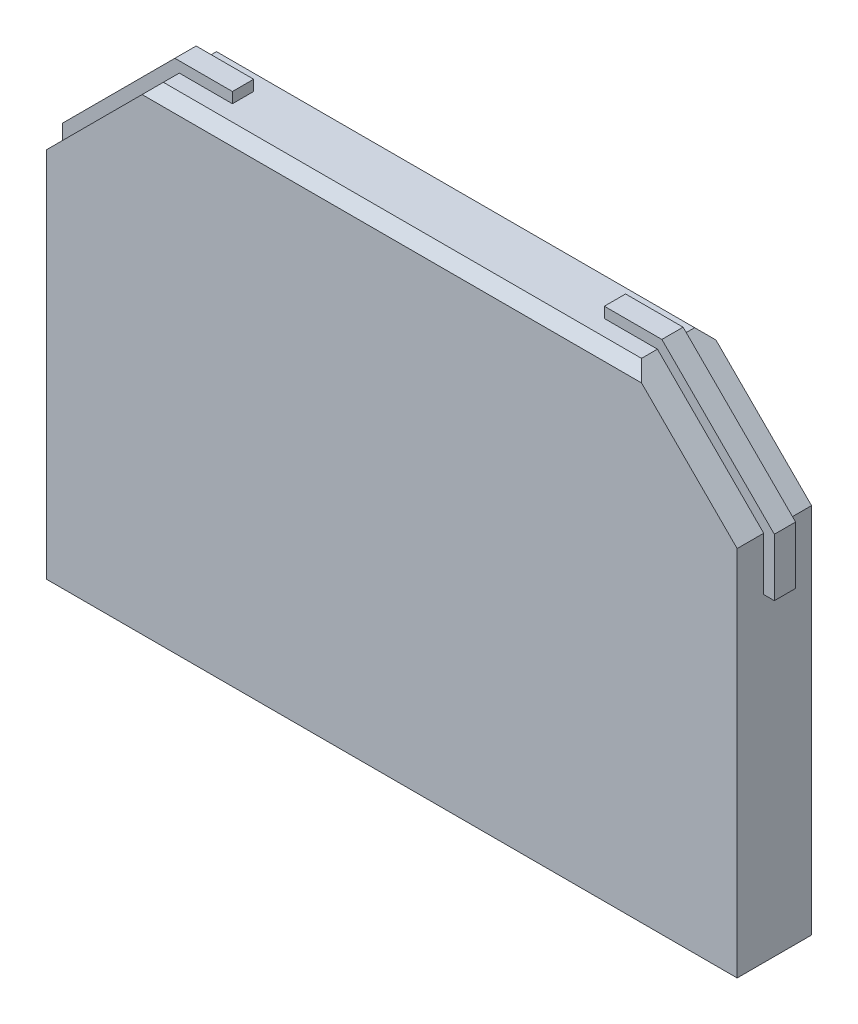
ISO-10303-21;
HEADER;
FILE_DESCRIPTION(('STEP AP214'),'2;1');
FILE_NAME('part.step','',(''),(''),'','','');
FILE_SCHEMA(('AUTOMOTIVE_DESIGN { 1 0 10303 214 1 1 1 1 }'));
ENDSEC;
DATA;
#1=APPLICATION_CONTEXT('core data for automotive mechanical design processes');
#2=APPLICATION_PROTOCOL_DEFINITION('international standard','automotive_design',2000,#1);
#3=PRODUCT_CONTEXT('',#1,'mechanical');
#4=PRODUCT('Part','Part','',(#3));
#5=PRODUCT_RELATED_PRODUCT_CATEGORY('part','',(#4));
#6=PRODUCT_DEFINITION_FORMATION('','',#4);
#7=PRODUCT_DEFINITION_CONTEXT('part definition',#1,'design');
#8=PRODUCT_DEFINITION('design','',#6,#7);
#9=PRODUCT_DEFINITION_SHAPE('','',#8);
#10=(LENGTH_UNIT() NAMED_UNIT(*) SI_UNIT(.MILLI.,.METRE.));
#11=(NAMED_UNIT(*) PLANE_ANGLE_UNIT() SI_UNIT($,.RADIAN.));
#12=(NAMED_UNIT(*) SI_UNIT($,.STERADIAN.) SOLID_ANGLE_UNIT());
#13=UNCERTAINTY_MEASURE_WITH_UNIT(LENGTH_MEASURE(1.E-05),#10,'distance_accuracy_value','');
#14=(GEOMETRIC_REPRESENTATION_CONTEXT(3) GLOBAL_UNCERTAINTY_ASSIGNED_CONTEXT((#13)) GLOBAL_UNIT_ASSIGNED_CONTEXT((#10,
#11,#12)) REPRESENTATION_CONTEXT('',''));
#15=CARTESIAN_POINT('',(0.,0.,0.));
#16=DIRECTION('',(0.,0.,1.));
#17=DIRECTION('',(1.,0.,0.));
#18=AXIS2_PLACEMENT_3D('',#15,#16,#17);
#19=CARTESIAN_POINT('',(0.,6.5,-0.25));
#20=DIRECTION('',(0.,-0.707106781186498,0.707106781186598));
#21=DIRECTION('',(-1.,0.,0.));
#22=AXIS2_PLACEMENT_3D('',#19,#20,#21);
#23=PLANE('',#22);
#24=DIRECTION('',(0.577350269189626,-0.577350269189626,-0.577350269189626));
#25=VECTOR('',#24,1.);
#26=CARTESIAN_POINT('',(2.25,6.5,-0.25));
#27=LINE('',#26,#25);
#28=CARTESIAN_POINT('',(2.25,6.5,-0.25));
#29=VERTEX_POINT('',#28);
#30=CARTESIAN_POINT('',(2.35,6.4,-0.35));
#31=VERTEX_POINT('',#30);
#32=EDGE_CURVE('E399',#29,#31,#27,.T.);
#33=ORIENTED_EDGE('',*,*,#32,.T.);
#34=DIRECTION('',(-1.,0.,0.));
#35=VECTOR('',#34,1.);
#36=CARTESIAN_POINT('',(2.35,6.4,-0.35));
#37=LINE('',#36,#35);
#38=CARTESIAN_POINT('',(-2.35,6.4,-0.35));
#39=VERTEX_POINT('',#38);
#40=EDGE_CURVE('E489',#31,#39,#37,.T.);
#41=ORIENTED_EDGE('',*,*,#40,.T.);
#42=DIRECTION('',(0.577350269189626,0.577350269189626,0.577350269189626));
#43=VECTOR('',#42,1.);
#44=CARTESIAN_POINT('',(-2.35,6.4,-0.35));
#45=LINE('',#44,#43);
#46=CARTESIAN_POINT('',(-2.25,6.5,-0.25));
#47=VERTEX_POINT('',#46);
#48=EDGE_CURVE('E37',#39,#47,#45,.T.);
#49=ORIENTED_EDGE('',*,*,#48,.T.);
#50=DIRECTION('',(1.,0.,0.));
#51=VECTOR('',#50,1.);
#52=CARTESIAN_POINT('',(-2.25,6.5,-0.25));
#53=LINE('',#52,#51);
#54=EDGE_CURVE('E355',#47,#29,#53,.T.);
#55=ORIENTED_EDGE('',*,*,#54,.T.);
#56=EDGE_LOOP('',(#33,#41,#49,#55));
#57=FACE_BOUND('',#56,.T.);
#58=ADVANCED_FACE('F17',(#57),#23,.F.);
#59=CARTESIAN_POINT('',(-2.291421356237,6.6,0.1));
#60=DIRECTION('',(-0.707106781186548,0.707106781186548,0.));
#61=DIRECTION('',(0.,0.,1.));
#62=AXIS2_PLACEMENT_3D('',#59,#60,#61);
#63=PLANE('',#62);
#64=DIRECTION('',(0.707106781186548,0.707106781186548,0.));
#65=VECTOR('',#64,1.);
#66=CARTESIAN_POINT('',(-3.35,5.541421356237,-0.1));
#67=LINE('',#66,#65);
#68=CARTESIAN_POINT('',(-3.35,5.541421356237,-0.1));
#69=VERTEX_POINT('',#68);
#70=CARTESIAN_POINT('',(-2.291421356237,6.6,-0.1));
#71=VERTEX_POINT('',#70);
#72=EDGE_CURVE('E432',#69,#71,#67,.T.);
#73=ORIENTED_EDGE('',*,*,#72,.F.);
#74=DIRECTION('',(0.,0.,1.));
#75=VECTOR('',#74,1.);
#76=CARTESIAN_POINT('',(-3.35,5.541421356237,-0.1));
#77=LINE('',#76,#75);
#78=CARTESIAN_POINT('',(-3.35,5.541421356237,0.1));
#79=VERTEX_POINT('',#78);
#80=EDGE_CURVE('E11',#69,#79,#77,.T.);
#81=ORIENTED_EDGE('',*,*,#80,.T.);
#82=DIRECTION('',(-0.707106781186548,-0.707106781186548,0.));
#83=VECTOR('',#82,1.);
#84=CARTESIAN_POINT('',(-2.291421356237,6.6,0.1));
#85=LINE('',#84,#83);
#86=CARTESIAN_POINT('',(-2.291421356237,6.6,0.1));
#87=VERTEX_POINT('',#86);
#88=EDGE_CURVE('E321',#87,#79,#85,.T.);
#89=ORIENTED_EDGE('',*,*,#88,.F.);
#90=DIRECTION('',(0.,0.,1.));
#91=VECTOR('',#90,1.);
#92=CARTESIAN_POINT('',(-2.291421356237,6.6,-0.1));
#93=LINE('',#92,#91);
#94=EDGE_CURVE('E294',#71,#87,#93,.T.);
#95=ORIENTED_EDGE('',*,*,#94,.F.);
#96=EDGE_LOOP('',(#73,#81,#89,#95));
#97=FACE_BOUND('',#96,.T.);
#98=ADVANCED_FACE('F517',(#97),#63,.T.);
#99=CARTESIAN_POINT('',(-3.35,5.541421356237,0.1));
#100=DIRECTION('',(-1.,0.,0.));
#101=DIRECTION('',(0.,0.,1.));
#102=AXIS2_PLACEMENT_3D('',#99,#100,#101);
#103=PLANE('',#102);
#104=DIRECTION('',(0.,-1.,0.));
#105=VECTOR('',#104,1.);
#106=CARTESIAN_POINT('',(-3.35,5.541421356237,-0.1));
#107=LINE('',#106,#105);
#108=CARTESIAN_POINT('',(-3.35,5.,-0.1));
#109=VERTEX_POINT('',#108);
#110=EDGE_CURVE('E452',#69,#109,#107,.T.);
#111=ORIENTED_EDGE('',*,*,#110,.T.);
#112=DIRECTION('',(0.,0.,1.));
#113=VECTOR('',#112,1.);
#114=CARTESIAN_POINT('',(-3.35,5.,-0.1));
#115=LINE('',#114,#113);
#116=CARTESIAN_POINT('',(-3.35,5.,0.1));
#117=VERTEX_POINT('',#116);
#118=EDGE_CURVE('E25',#109,#117,#115,.T.);
#119=ORIENTED_EDGE('',*,*,#118,.T.);
#120=DIRECTION('',(0.,-1.,0.));
#121=VECTOR('',#120,1.);
#122=CARTESIAN_POINT('',(-3.35,5.541421356237,0.1));
#123=LINE('',#122,#121);
#124=EDGE_CURVE('E325',#79,#117,#123,.T.);
#125=ORIENTED_EDGE('',*,*,#124,.F.);
#126=ORIENTED_EDGE('',*,*,#80,.F.);
#127=EDGE_LOOP('',(#111,#119,#125,#126));
#128=FACE_BOUND('',#127,.T.);
#129=ADVANCED_FACE('F507',(#128),#103,.T.);
#130=CARTESIAN_POINT('',(-3.25,5.,0.1));
#131=DIRECTION('',(0.,-1.,0.));
#132=DIRECTION('',(0.,0.,-1.));
#133=AXIS2_PLACEMENT_3D('',#130,#131,#132);
#134=PLANE('',#133);
#135=DIRECTION('',(1.,0.,0.));
#136=VECTOR('',#135,1.);
#137=CARTESIAN_POINT('',(-3.35,5.,-0.1));
#138=LINE('',#137,#136);
#139=CARTESIAN_POINT('',(-3.25,5.,-0.1));
#140=VERTEX_POINT('',#139);
#141=EDGE_CURVE('E448',#109,#140,#138,.T.);
#142=ORIENTED_EDGE('',*,*,#141,.T.);
#143=DIRECTION('',(0.,0.,1.));
#144=VECTOR('',#143,1.);
#145=CARTESIAN_POINT('',(-3.25,5.,-0.1));
#146=LINE('',#145,#144);
#147=CARTESIAN_POINT('',(-3.25,5.,0.1));
#148=VERTEX_POINT('',#147);
#149=EDGE_CURVE('E499',#140,#148,#146,.T.);
#150=ORIENTED_EDGE('',*,*,#149,.T.);
#151=DIRECTION('',(1.,0.,0.));
#152=VECTOR('',#151,1.);
#153=CARTESIAN_POINT('',(-3.35,5.,0.1));
#154=LINE('',#153,#152);
#155=EDGE_CURVE('E293',#117,#148,#154,.T.);
#156=ORIENTED_EDGE('',*,*,#155,.F.);
#157=ORIENTED_EDGE('',*,*,#118,.F.);
#158=EDGE_LOOP('',(#142,#150,#156,#157));
#159=FACE_BOUND('',#158,.T.);
#160=ADVANCED_FACE('F511',(#159),#134,.T.);
#161=CARTESIAN_POINT('',(-3.25,6.5,0.35));
#162=DIRECTION('',(1.,0.,0.));
#163=DIRECTION('',(0.,1.,0.));
#164=AXIS2_PLACEMENT_3D('',#161,#162,#163);
#165=PLANE('',#164);
#166=DIRECTION('',(0.,0.,1.));
#167=VECTOR('',#166,1.);
#168=CARTESIAN_POINT('',(-3.25,5.5,0.1));
#169=LINE('',#168,#167);
#170=CARTESIAN_POINT('',(-3.25,5.5,0.1));
#171=VERTEX_POINT('',#170);
#172=CARTESIAN_POINT('',(-3.25,5.5,0.35));
#173=VERTEX_POINT('',#172);
#174=EDGE_CURVE('E470',#171,#173,#169,.T.);
#175=ORIENTED_EDGE('',*,*,#174,.F.);
#176=DIRECTION('',(0.,1.,0.));
#177=VECTOR('',#176,1.);
#178=CARTESIAN_POINT('',(-3.25,5.,0.1));
#179=LINE('',#178,#177);
#180=EDGE_CURVE('E288',#148,#171,#179,.T.);
#181=ORIENTED_EDGE('',*,*,#180,.F.);
#182=ORIENTED_EDGE('',*,*,#149,.F.);
#183=DIRECTION('',(0.,1.,0.));
#184=VECTOR('',#183,1.);
#185=CARTESIAN_POINT('',(-3.25,5.,-0.1));
#186=LINE('',#185,#184);
#187=CARTESIAN_POINT('',(-3.25,5.5,-0.1));
#188=VERTEX_POINT('',#187);
#189=EDGE_CURVE('E365',#140,#188,#186,.T.);
#190=ORIENTED_EDGE('',*,*,#189,.T.);
#191=DIRECTION('',(0.,0.,1.));
#192=VECTOR('',#191,1.);
#193=CARTESIAN_POINT('',(-3.25,5.5,-0.35));
#194=LINE('',#193,#192);
#195=CARTESIAN_POINT('',(-3.25,5.5,-0.35));
#196=VERTEX_POINT('',#195);
#197=EDGE_CURVE('E47',#196,#188,#194,.T.);
#198=ORIENTED_EDGE('',*,*,#197,.F.);
#199=DIRECTION('',(0.,1.,0.));
#200=VECTOR('',#199,1.);
#201=CARTESIAN_POINT('',(-3.25,2.,-0.35));
#202=LINE('',#201,#200);
#203=CARTESIAN_POINT('',(-3.25,2.,-0.35));
#204=VERTEX_POINT('',#203);
#205=EDGE_CURVE('E492',#204,#196,#202,.T.);
#206=ORIENTED_EDGE('',*,*,#205,.F.);
#207=DIRECTION('',(0.,0.,-1.));
#208=VECTOR('',#207,1.);
#209=CARTESIAN_POINT('',(-3.25,2.,0.35));
#210=LINE('',#209,#208);
#211=CARTESIAN_POINT('',(-3.25,2.,0.35));
#212=VERTEX_POINT('',#211);
#213=EDGE_CURVE('E315',#212,#204,#210,.T.);
#214=ORIENTED_EDGE('',*,*,#213,.F.);
#215=DIRECTION('',(0.,1.,0.));
#216=VECTOR('',#215,1.);
#217=CARTESIAN_POINT('',(-3.25,2.,0.35));
#218=LINE('',#217,#216);
#219=EDGE_CURVE('E337',#212,#173,#218,.T.);
#220=ORIENTED_EDGE('',*,*,#219,.T.);
#221=EDGE_LOOP('',(#175,#181,#182,#190,#198,#206,#214,#220));
#222=FACE_BOUND('',#221,.T.);
#223=ADVANCED_FACE('F522',(#222),#165,.F.);
#224=CARTESIAN_POINT('',(-2.25,6.5,0.));
#225=DIRECTION('',(0.707106781186548,-0.707106781186548,0.));
#226=DIRECTION('',(0.,0.,-1.));
#227=AXIS2_PLACEMENT_3D('',#224,#225,#226);
#228=PLANE('',#227);
#229=ORIENTED_EDGE('',*,*,#197,.T.);
#230=DIRECTION('',(-0.707106781186548,-0.707106781186548,0.));
#231=VECTOR('',#230,1.);
#232=CARTESIAN_POINT('',(-2.25,6.5,-0.1));
#233=LINE('',#232,#231);
#234=CARTESIAN_POINT('',(-2.25,6.5,-0.1));
#235=VERTEX_POINT('',#234);
#236=EDGE_CURVE('E361',#235,#188,#233,.T.);
#237=ORIENTED_EDGE('',*,*,#236,.F.);
#238=DIRECTION('',(0.,0.,-1.));
#239=VECTOR('',#238,1.);
#240=CARTESIAN_POINT('',(-2.25,6.5,-0.1));
#241=LINE('',#240,#239);
#242=EDGE_CURVE('E351',#235,#47,#241,.T.);
#243=ORIENTED_EDGE('',*,*,#242,.T.);
#244=ORIENTED_EDGE('',*,*,#48,.F.);
#245=DIRECTION('',(0.707106781186548,0.707106781186548,0.));
#246=VECTOR('',#245,1.);
#247=CARTESIAN_POINT('',(-3.25,5.5,-0.35));
#248=LINE('',#247,#246);
#249=EDGE_CURVE('E442',#196,#39,#248,.T.);
#250=ORIENTED_EDGE('',*,*,#249,.F.);
#251=EDGE_LOOP('',(#229,#237,#243,#244,#250));
#252=FACE_BOUND('',#251,.T.);
#253=ADVANCED_FACE('F541',(#252),#228,.F.);
#254=CARTESIAN_POINT('',(-3.25,6.5,-0.35));
#255=DIRECTION('',(0.,0.,1.));
#256=DIRECTION('',(1.,0.,0.));
#257=AXIS2_PLACEMENT_3D('',#254,#255,#256);
#258=PLANE('',#257);
#259=ORIENTED_EDGE('',*,*,#249,.T.);
#260=ORIENTED_EDGE('',*,*,#40,.F.);
#261=DIRECTION('',(0.707106781186548,-0.707106781186548,0.));
#262=VECTOR('',#261,1.);
#263=CARTESIAN_POINT('',(2.35,6.4,-0.35));
#264=LINE('',#263,#262);
#265=CARTESIAN_POINT('',(3.25,5.5,-0.35));
#266=VERTEX_POINT('',#265);
#267=EDGE_CURVE('E396',#31,#266,#264,.T.);
#268=ORIENTED_EDGE('',*,*,#267,.T.);
#269=DIRECTION('',(0.,1.,0.));
#270=VECTOR('',#269,1.);
#271=CARTESIAN_POINT('',(3.25,2.,-0.35));
#272=LINE('',#271,#270);
#273=CARTESIAN_POINT('',(3.25,2.,-0.35));
#274=VERTEX_POINT('',#273);
#275=EDGE_CURVE('E307',#274,#266,#272,.T.);
#276=ORIENTED_EDGE('',*,*,#275,.F.);
#277=DIRECTION('',(1.,0.,0.));
#278=VECTOR('',#277,1.);
#279=CARTESIAN_POINT('',(-3.25,2.,-0.35));
#280=LINE('',#279,#278);
#281=EDGE_CURVE('E319',#204,#274,#280,.T.);
#282=ORIENTED_EDGE('',*,*,#281,.F.);
#283=ORIENTED_EDGE('',*,*,#205,.T.);
#284=EDGE_LOOP('',(#259,#260,#268,#276,#282,#283));
#285=FACE_BOUND('',#284,.T.);
#286=ADVANCED_FACE('F543',(#285),#258,.F.);
#287=CARTESIAN_POINT('',(0.,2.,0.));
#288=DIRECTION('',(0.,-1.,0.));
#289=DIRECTION('',(0.,0.,-1.));
#290=AXIS2_PLACEMENT_3D('',#287,#288,#289);
#291=PLANE('',#290);
#292=DIRECTION('',(0.,0.,1.));
#293=VECTOR('',#292,1.);
#294=CARTESIAN_POINT('',(3.25,2.,-0.35));
#295=LINE('',#294,#293);
#296=CARTESIAN_POINT('',(3.25,2.,0.35));
#297=VERTEX_POINT('',#296);
#298=EDGE_CURVE('E387',#274,#297,#295,.T.);
#299=ORIENTED_EDGE('',*,*,#298,.T.);
#300=DIRECTION('',(-1.,0.,0.));
#301=VECTOR('',#300,1.);
#302=CARTESIAN_POINT('',(3.25,2.,0.35));
#303=LINE('',#302,#301);
#304=EDGE_CURVE('E320',#297,#212,#303,.T.);
#305=ORIENTED_EDGE('',*,*,#304,.T.);
#306=ORIENTED_EDGE('',*,*,#213,.T.);
#307=ORIENTED_EDGE('',*,*,#281,.T.);
#308=EDGE_LOOP('',(#299,#305,#306,#307));
#309=FACE_BOUND('',#308,.T.);
#310=ADVANCED_FACE('F548',(#309),#291,.T.);
#311=CARTESIAN_POINT('',(-3.25,6.5,0.35));
#312=DIRECTION('',(0.,0.,-1.));
#313=DIRECTION('',(0.,-1.,0.));
#314=AXIS2_PLACEMENT_3D('',#311,#312,#313);
#315=PLANE('',#314);
#316=DIRECTION('',(-0.707106781186548,0.707106781186548,0.));
#317=VECTOR('',#316,1.);
#318=CARTESIAN_POINT('',(3.25,5.5,0.35));
#319=LINE('',#318,#317);
#320=CARTESIAN_POINT('',(3.25,5.5,0.35));
#321=VERTEX_POINT('',#320);
#322=CARTESIAN_POINT('',(2.35,6.4,0.35));
#323=VERTEX_POINT('',#322);
#324=EDGE_CURVE('E269',#321,#323,#319,.T.);
#325=ORIENTED_EDGE('',*,*,#324,.T.);
#326=DIRECTION('',(1.,0.,0.));
#327=VECTOR('',#326,1.);
#328=CARTESIAN_POINT('',(-2.35,6.4,0.35));
#329=LINE('',#328,#327);
#330=CARTESIAN_POINT('',(-2.35,6.4,0.35));
#331=VERTEX_POINT('',#330);
#332=EDGE_CURVE('E279',#331,#323,#329,.T.);
#333=ORIENTED_EDGE('',*,*,#332,.F.);
#334=DIRECTION('',(-0.707106781186548,-0.707106781186548,0.));
#335=VECTOR('',#334,1.);
#336=CARTESIAN_POINT('',(-2.35,6.4,0.35));
#337=LINE('',#336,#335);
#338=EDGE_CURVE('E280',#331,#173,#337,.T.);
#339=ORIENTED_EDGE('',*,*,#338,.T.);
#340=ORIENTED_EDGE('',*,*,#219,.F.);
#341=ORIENTED_EDGE('',*,*,#304,.F.);
#342=DIRECTION('',(0.,1.,0.));
#343=VECTOR('',#342,1.);
#344=CARTESIAN_POINT('',(3.25,2.,0.35));
#345=LINE('',#344,#343);
#346=EDGE_CURVE('E383',#297,#321,#345,.T.);
#347=ORIENTED_EDGE('',*,*,#346,.T.);
#348=EDGE_LOOP('',(#325,#333,#339,#340,#341,#347));
#349=FACE_BOUND('',#348,.T.);
#350=ADVANCED_FACE('F552',(#349),#315,.F.);
#351=CARTESIAN_POINT('',(2.25,6.5,0.));
#352=DIRECTION('',(-0.707106781186548,-0.707106781186548,0.));
#353=DIRECTION('',(-0.707106781186548,0.707106781186548,0.));
#354=AXIS2_PLACEMENT_3D('',#351,#352,#353);
#355=PLANE('',#354);
#356=DIRECTION('',(0.707106781186548,-0.707106781186548,0.));
#357=VECTOR('',#356,1.);
#358=CARTESIAN_POINT('',(2.25,6.5,0.1));
#359=LINE('',#358,#357);
#360=CARTESIAN_POINT('',(2.25,6.5,0.1));
#361=VERTEX_POINT('',#360);
#362=CARTESIAN_POINT('',(3.25,5.5,0.1));
#363=VERTEX_POINT('',#362);
#364=EDGE_CURVE('E372',#361,#363,#359,.T.);
#365=ORIENTED_EDGE('',*,*,#364,.F.);
#366=DIRECTION('',(0.,0.,1.));
#367=VECTOR('',#366,1.);
#368=CARTESIAN_POINT('',(2.25,6.5,0.1));
#369=LINE('',#368,#367);
#370=CARTESIAN_POINT('',(2.25,6.5,0.25));
#371=VERTEX_POINT('',#370);
#372=EDGE_CURVE('E419',#361,#371,#369,.T.);
#373=ORIENTED_EDGE('',*,*,#372,.T.);
#374=DIRECTION('',(-0.577350269189626,0.577350269189626,-0.577350269189626));
#375=VECTOR('',#374,1.);
#376=CARTESIAN_POINT('',(2.35,6.4,0.35));
#377=LINE('',#376,#375);
#378=EDGE_CURVE('E477',#323,#371,#377,.T.);
#379=ORIENTED_EDGE('',*,*,#378,.F.);
#380=ORIENTED_EDGE('',*,*,#324,.F.);
#381=DIRECTION('',(0.,0.,-1.));
#382=VECTOR('',#381,1.);
#383=CARTESIAN_POINT('',(3.25,5.5,0.35));
#384=LINE('',#383,#382);
#385=EDGE_CURVE('E380',#321,#363,#384,.T.);
#386=ORIENTED_EDGE('',*,*,#385,.T.);
#387=EDGE_LOOP('',(#365,#373,#379,#380,#386));
#388=FACE_BOUND('',#387,.T.);
#389=ADVANCED_FACE('F560',(#388),#355,.F.);
#390=CARTESIAN_POINT('',(0.,6.5,0.25));
#391=DIRECTION('',(0.,-0.707106781186548,-0.707106781186548));
#392=DIRECTION('',(0.,-0.707106781186548,0.707106781186548));
#393=AXIS2_PLACEMENT_3D('',#390,#391,#392);
#394=PLANE('',#393);
#395=DIRECTION('',(-0.577350269189626,-0.577350269189626,0.577350269189626));
#396=VECTOR('',#395,1.);
#397=CARTESIAN_POINT('',(-2.25,6.5,0.25));
#398=LINE('',#397,#396);
#399=CARTESIAN_POINT('',(-2.25,6.5,0.25));
#400=VERTEX_POINT('',#399);
#401=EDGE_CURVE('E276',#400,#331,#398,.T.);
#402=ORIENTED_EDGE('',*,*,#401,.T.);
#403=ORIENTED_EDGE('',*,*,#332,.T.);
#404=ORIENTED_EDGE('',*,*,#378,.T.);
#405=DIRECTION('',(-1.,0.,0.));
#406=VECTOR('',#405,1.);
#407=CARTESIAN_POINT('',(2.25,6.5,0.25));
#408=LINE('',#407,#406);
#409=EDGE_CURVE('E415',#371,#400,#408,.T.);
#410=ORIENTED_EDGE('',*,*,#409,.T.);
#411=EDGE_LOOP('',(#402,#403,#404,#410));
#412=FACE_BOUND('',#411,.T.);
#413=ADVANCED_FACE('F555',(#412),#394,.F.);
#414=CARTESIAN_POINT('',(-2.25,6.5,0.));
#415=DIRECTION('',(0.707106781186548,-0.707106781186548,0.));
#416=DIRECTION('',(0.,0.,-1.));
#417=AXIS2_PLACEMENT_3D('',#414,#415,#416);
#418=PLANE('',#417);
#419=DIRECTION('',(0.707106781186548,0.707106781186548,0.));
#420=VECTOR('',#419,1.);
#421=CARTESIAN_POINT('',(-3.25,5.5,0.1));
#422=LINE('',#421,#420);
#423=CARTESIAN_POINT('',(-2.25,6.5,0.1));
#424=VERTEX_POINT('',#423);
#425=EDGE_CURVE('E292',#171,#424,#422,.T.);
#426=ORIENTED_EDGE('',*,*,#425,.F.);
#427=ORIENTED_EDGE('',*,*,#174,.T.);
#428=ORIENTED_EDGE('',*,*,#338,.F.);
#429=ORIENTED_EDGE('',*,*,#401,.F.);
#430=DIRECTION('',(0.,0.,-1.));
#431=VECTOR('',#430,1.);
#432=CARTESIAN_POINT('',(-2.25,6.5,0.25));
#433=LINE('',#432,#431);
#434=EDGE_CURVE('E411',#400,#424,#433,.T.);
#435=ORIENTED_EDGE('',*,*,#434,.T.);
#436=EDGE_LOOP('',(#426,#427,#428,#429,#435));
#437=FACE_BOUND('',#436,.T.);
#438=ADVANCED_FACE('F527',(#437),#418,.F.);
#439=CARTESIAN_POINT('',(0.,0.,0.1));
#440=DIRECTION('',(0.,0.,1.));
#441=DIRECTION('',(1.,0.,0.));
#442=AXIS2_PLACEMENT_3D('',#439,#440,#441);
#443=PLANE('',#442);
#444=DIRECTION('',(0.,1.,0.));
#445=VECTOR('',#444,1.);
#446=CARTESIAN_POINT('',(-1.75,6.5,0.1));
#447=LINE('',#446,#445);
#448=CARTESIAN_POINT('',(-1.75,6.5,0.1));
#449=VERTEX_POINT('',#448);
#450=CARTESIAN_POINT('',(-1.75,6.6,0.1));
#451=VERTEX_POINT('',#450);
#452=EDGE_CURVE('E366',#449,#451,#447,.T.);
#453=ORIENTED_EDGE('',*,*,#452,.T.);
#454=DIRECTION('',(-1.,0.,0.));
#455=VECTOR('',#454,1.);
#456=CARTESIAN_POINT('',(-1.75,6.6,0.1));
#457=LINE('',#456,#455);
#458=EDGE_CURVE('E298',#451,#87,#457,.T.);
#459=ORIENTED_EDGE('',*,*,#458,.T.);
#460=ORIENTED_EDGE('',*,*,#88,.T.);
#461=ORIENTED_EDGE('',*,*,#124,.T.);
#462=ORIENTED_EDGE('',*,*,#155,.T.);
#463=ORIENTED_EDGE('',*,*,#180,.T.);
#464=ORIENTED_EDGE('',*,*,#425,.T.);
#465=DIRECTION('',(1.,0.,0.));
#466=VECTOR('',#465,1.);
#467=CARTESIAN_POINT('',(-2.25,6.5,0.1));
#468=LINE('',#467,#466);
#469=EDGE_CURVE('E407',#424,#449,#468,.T.);
#470=ORIENTED_EDGE('',*,*,#469,.T.);
#471=EDGE_LOOP('',(#453,#459,#460,#461,#462,#463,#464,#470));
#472=FACE_BOUND('',#471,.T.);
#473=ADVANCED_FACE('F514',(#472),#443,.T.);
#474=CARTESIAN_POINT('',(-2.291421356237,6.6,0.1));
#475=DIRECTION('',(0.,1.,0.));
#476=DIRECTION('',(1.,0.,0.));
#477=AXIS2_PLACEMENT_3D('',#474,#475,#476);
#478=PLANE('',#477);
#479=DIRECTION('',(-1.,0.,0.));
#480=VECTOR('',#479,1.);
#481=CARTESIAN_POINT('',(-1.75,6.6,-0.1));
#482=LINE('',#481,#480);
#483=CARTESIAN_POINT('',(-1.75,6.6,-0.1));
#484=VERTEX_POINT('',#483);
#485=EDGE_CURVE('E299',#484,#71,#482,.T.);
#486=ORIENTED_EDGE('',*,*,#485,.T.);
#487=ORIENTED_EDGE('',*,*,#94,.T.);
#488=ORIENTED_EDGE('',*,*,#458,.F.);
#489=DIRECTION('',(0.,0.,1.));
#490=VECTOR('',#489,1.);
#491=CARTESIAN_POINT('',(-1.75,6.6,-0.1));
#492=LINE('',#491,#490);
#493=EDGE_CURVE('E436',#484,#451,#492,.T.);
#494=ORIENTED_EDGE('',*,*,#493,.F.);
#495=EDGE_LOOP('',(#486,#487,#488,#494));
#496=FACE_BOUND('',#495,.T.);
#497=ADVANCED_FACE('F538',(#496),#478,.T.);
#498=CARTESIAN_POINT('',(0.,0.,-0.1));
#499=DIRECTION('',(0.,0.,1.));
#500=DIRECTION('',(1.,0.,0.));
#501=AXIS2_PLACEMENT_3D('',#498,#499,#500);
#502=PLANE('',#501);
#503=DIRECTION('',(0.,1.,0.));
#504=VECTOR('',#503,1.);
#505=CARTESIAN_POINT('',(-1.75,6.5,-0.1));
#506=LINE('',#505,#504);
#507=CARTESIAN_POINT('',(-1.75,6.5,-0.1));
#508=VERTEX_POINT('',#507);
#509=EDGE_CURVE('E428',#508,#484,#506,.T.);
#510=ORIENTED_EDGE('',*,*,#509,.F.);
#511=DIRECTION('',(1.,0.,0.));
#512=VECTOR('',#511,1.);
#513=CARTESIAN_POINT('',(-2.25,6.5,-0.1));
#514=LINE('',#513,#512);
#515=EDGE_CURVE('E354',#235,#508,#514,.T.);
#516=ORIENTED_EDGE('',*,*,#515,.F.);
#517=ORIENTED_EDGE('',*,*,#236,.T.);
#518=ORIENTED_EDGE('',*,*,#189,.F.);
#519=ORIENTED_EDGE('',*,*,#141,.F.);
#520=ORIENTED_EDGE('',*,*,#110,.F.);
#521=ORIENTED_EDGE('',*,*,#72,.T.);
#522=ORIENTED_EDGE('',*,*,#485,.F.);
#523=EDGE_LOOP('',(#510,#516,#517,#518,#519,#520,#521,#522));
#524=FACE_BOUND('',#523,.T.);
#525=ADVANCED_FACE('F519',(#524),#502,.F.);
#526=CARTESIAN_POINT('',(-1.75,6.5,0.1));
#527=DIRECTION('',(1.,0.,0.));
#528=DIRECTION('',(0.,1.,0.));
#529=AXIS2_PLACEMENT_3D('',#526,#527,#528);
#530=PLANE('',#529);
#531=ORIENTED_EDGE('',*,*,#509,.T.);
#532=ORIENTED_EDGE('',*,*,#493,.T.);
#533=ORIENTED_EDGE('',*,*,#452,.F.);
#534=DIRECTION('',(0.,0.,1.));
#535=VECTOR('',#534,1.);
#536=CARTESIAN_POINT('',(-1.75,6.5,-0.1));
#537=LINE('',#536,#535);
#538=EDGE_CURVE('E403',#508,#449,#537,.T.);
#539=ORIENTED_EDGE('',*,*,#538,.F.);
#540=EDGE_LOOP('',(#531,#532,#533,#539));
#541=FACE_BOUND('',#540,.T.);
#542=ADVANCED_FACE('F535',(#541),#530,.T.);
#543=CARTESIAN_POINT('',(0.,6.5,0.));
#544=DIRECTION('',(0.,-1.,0.));
#545=DIRECTION('',(0.,0.,-1.));
#546=AXIS2_PLACEMENT_3D('',#543,#544,#545);
#547=PLANE('',#546);
#548=ORIENTED_EDGE('',*,*,#538,.T.);
#549=ORIENTED_EDGE('',*,*,#469,.F.);
#550=ORIENTED_EDGE('',*,*,#434,.F.);
#551=ORIENTED_EDGE('',*,*,#409,.F.);
#552=ORIENTED_EDGE('',*,*,#372,.F.);
#553=DIRECTION('',(-1.,0.,0.));
#554=VECTOR('',#553,1.);
#555=CARTESIAN_POINT('',(2.25,6.5,0.1));
#556=LINE('',#555,#554);
#557=CARTESIAN_POINT('',(1.75,6.5,0.1));
#558=VERTEX_POINT('',#557);
#559=EDGE_CURVE('E369',#361,#558,#556,.T.);
#560=ORIENTED_EDGE('',*,*,#559,.T.);
#561=DIRECTION('',(0.,0.,1.));
#562=VECTOR('',#561,1.);
#563=CARTESIAN_POINT('',(1.75,6.5,-0.1));
#564=LINE('',#563,#562);
#565=CARTESIAN_POINT('',(1.75,6.5,-0.1));
#566=VERTEX_POINT('',#565);
#567=EDGE_CURVE('E308',#566,#558,#564,.T.);
#568=ORIENTED_EDGE('',*,*,#567,.F.);
#569=DIRECTION('',(-1.,0.,0.));
#570=VECTOR('',#569,1.);
#571=CARTESIAN_POINT('',(2.25,6.5,-0.1));
#572=LINE('',#571,#570);
#573=CARTESIAN_POINT('',(2.25,6.5,-0.1));
#574=VERTEX_POINT('',#573);
#575=EDGE_CURVE('E312',#574,#566,#572,.T.);
#576=ORIENTED_EDGE('',*,*,#575,.F.);
#577=DIRECTION('',(0.,0.,1.));
#578=VECTOR('',#577,1.);
#579=CARTESIAN_POINT('',(2.25,6.5,-0.25));
#580=LINE('',#579,#578);
#581=EDGE_CURVE('E306',#29,#574,#580,.T.);
#582=ORIENTED_EDGE('',*,*,#581,.F.);
#583=ORIENTED_EDGE('',*,*,#54,.F.);
#584=ORIENTED_EDGE('',*,*,#242,.F.);
#585=ORIENTED_EDGE('',*,*,#515,.T.);
#586=EDGE_LOOP('',(#548,#549,#550,#551,#552,#560,#568,#576,#582,#583,#584,#585));
#587=FACE_BOUND('',#586,.T.);
#588=ADVANCED_FACE('F531',(#587),#547,.F.);
#589=CARTESIAN_POINT('',(2.25,6.5,0.));
#590=DIRECTION('',(-0.707106781186548,-0.707106781186548,0.));
#591=DIRECTION('',(-0.707106781186548,0.707106781186548,0.));
#592=AXIS2_PLACEMENT_3D('',#589,#590,#591);
#593=PLANE('',#592);
#594=ORIENTED_EDGE('',*,*,#581,.T.);
#595=DIRECTION('',(-0.707106781186548,0.707106781186548,0.));
#596=VECTOR('',#595,1.);
#597=CARTESIAN_POINT('',(3.25,5.5,-0.1));
#598=LINE('',#597,#596);
#599=CARTESIAN_POINT('',(3.25,5.5,-0.1));
#600=VERTEX_POINT('',#599);
#601=EDGE_CURVE('E328',#600,#574,#598,.T.);
#602=ORIENTED_EDGE('',*,*,#601,.F.);
#603=DIRECTION('',(0.,0.,-1.));
#604=VECTOR('',#603,1.);
#605=CARTESIAN_POINT('',(3.25,5.5,-0.1));
#606=LINE('',#605,#604);
#607=EDGE_CURVE('E302',#600,#266,#606,.T.);
#608=ORIENTED_EDGE('',*,*,#607,.T.);
#609=ORIENTED_EDGE('',*,*,#267,.F.);
#610=ORIENTED_EDGE('',*,*,#32,.F.);
#611=EDGE_LOOP('',(#594,#602,#608,#609,#610));
#612=FACE_BOUND('',#611,.T.);
#613=ADVANCED_FACE('F570',(#612),#593,.F.);
#614=CARTESIAN_POINT('',(3.25,6.5,0.35));
#615=DIRECTION('',(-1.,0.,0.));
#616=DIRECTION('',(0.,0.,1.));
#617=AXIS2_PLACEMENT_3D('',#614,#615,#616);
#618=PLANE('',#617);
#619=DIRECTION('',(0.,0.,1.));
#620=VECTOR('',#619,1.);
#621=CARTESIAN_POINT('',(3.25,5.,-0.1));
#622=LINE('',#621,#620);
#623=CARTESIAN_POINT('',(3.25,5.,-0.1));
#624=VERTEX_POINT('',#623);
#625=CARTESIAN_POINT('',(3.25,5.,0.1));
#626=VERTEX_POINT('',#625);
#627=EDGE_CURVE('E261',#624,#626,#622,.T.);
#628=ORIENTED_EDGE('',*,*,#627,.T.);
#629=DIRECTION('',(0.,1.,0.));
#630=VECTOR('',#629,1.);
#631=CARTESIAN_POINT('',(3.25,5.,0.1));
#632=LINE('',#631,#630);
#633=EDGE_CURVE('E376',#626,#363,#632,.T.);
#634=ORIENTED_EDGE('',*,*,#633,.T.);
#635=ORIENTED_EDGE('',*,*,#385,.F.);
#636=ORIENTED_EDGE('',*,*,#346,.F.);
#637=ORIENTED_EDGE('',*,*,#298,.F.);
#638=ORIENTED_EDGE('',*,*,#275,.T.);
#639=ORIENTED_EDGE('',*,*,#607,.F.);
#640=DIRECTION('',(0.,1.,0.));
#641=VECTOR('',#640,1.);
#642=CARTESIAN_POINT('',(3.25,5.,-0.1));
#643=LINE('',#642,#641);
#644=EDGE_CURVE('E246',#624,#600,#643,.T.);
#645=ORIENTED_EDGE('',*,*,#644,.F.);
#646=EDGE_LOOP('',(#628,#634,#635,#636,#637,#638,#639,#645));
#647=FACE_BOUND('',#646,.T.);
#648=ADVANCED_FACE('F602',(#647),#618,.F.);
#649=CARTESIAN_POINT('',(0.,0.,0.1));
#650=DIRECTION('',(0.,0.,1.));
#651=DIRECTION('',(1.,0.,0.));
#652=AXIS2_PLACEMENT_3D('',#649,#650,#651);
#653=PLANE('',#652);
#654=DIRECTION('',(0.,1.,0.));
#655=VECTOR('',#654,1.);
#656=CARTESIAN_POINT('',(1.75,6.5,0.1));
#657=LINE('',#656,#655);
#658=CARTESIAN_POINT('',(1.75,6.6,0.1));
#659=VERTEX_POINT('',#658);
#660=EDGE_CURVE('E287',#558,#659,#657,.T.);
#661=ORIENTED_EDGE('',*,*,#660,.F.);
#662=ORIENTED_EDGE('',*,*,#559,.F.);
#663=ORIENTED_EDGE('',*,*,#364,.T.);
#664=ORIENTED_EDGE('',*,*,#633,.F.);
#665=DIRECTION('',(-1.,0.,0.));
#666=VECTOR('',#665,1.);
#667=CARTESIAN_POINT('',(3.35,5.,0.1));
#668=LINE('',#667,#666);
#669=CARTESIAN_POINT('',(3.35,5.,0.1));
#670=VERTEX_POINT('',#669);
#671=EDGE_CURVE('E256',#670,#626,#668,.T.);
#672=ORIENTED_EDGE('',*,*,#671,.F.);
#673=DIRECTION('',(0.,-1.,0.));
#674=VECTOR('',#673,1.);
#675=CARTESIAN_POINT('',(3.35,5.541421356237,0.1));
#676=LINE('',#675,#674);
#677=CARTESIAN_POINT('',(3.35,5.541421356237,0.1));
#678=VERTEX_POINT('',#677);
#679=EDGE_CURVE('E251',#678,#670,#676,.T.);
#680=ORIENTED_EDGE('',*,*,#679,.F.);
#681=DIRECTION('',(-0.707106781186548,0.707106781186548,0.));
#682=VECTOR('',#681,1.);
#683=CARTESIAN_POINT('',(3.35,5.541421356237,0.1));
#684=LINE('',#683,#682);
#685=CARTESIAN_POINT('',(2.291421356237,6.6,0.1));
#686=VERTEX_POINT('',#685);
#687=EDGE_CURVE('E350',#678,#686,#684,.T.);
#688=ORIENTED_EDGE('',*,*,#687,.T.);
#689=DIRECTION('',(1.,0.,0.));
#690=VECTOR('',#689,1.);
#691=CARTESIAN_POINT('',(1.75,6.6,0.1));
#692=LINE('',#691,#690);
#693=EDGE_CURVE('E286',#659,#686,#692,.T.);
#694=ORIENTED_EDGE('',*,*,#693,.F.);
#695=EDGE_LOOP('',(#661,#662,#663,#664,#672,#680,#688,#694));
#696=FACE_BOUND('',#695,.T.);
#697=ADVANCED_FACE('F563',(#696),#653,.T.);
#698=CARTESIAN_POINT('',(3.35,5.541421356237,0.1));
#699=DIRECTION('',(-1.,0.,0.));
#700=DIRECTION('',(0.,0.,1.));
#701=AXIS2_PLACEMENT_3D('',#698,#699,#700);
#702=PLANE('',#701);
#703=DIRECTION('',(0.,-1.,0.));
#704=VECTOR('',#703,1.);
#705=CARTESIAN_POINT('',(3.35,5.541421356237,-0.1));
#706=LINE('',#705,#704);
#707=CARTESIAN_POINT('',(3.35,5.541421356237,-0.1));
#708=VERTEX_POINT('',#707);
#709=CARTESIAN_POINT('',(3.35,5.,-0.1));
#710=VERTEX_POINT('',#709);
#711=EDGE_CURVE('E233',#708,#710,#706,.T.);
#712=ORIENTED_EDGE('',*,*,#711,.F.);
#713=DIRECTION('',(0.,0.,1.));
#714=VECTOR('',#713,1.);
#715=CARTESIAN_POINT('',(3.35,5.541421356237,-0.1));
#716=LINE('',#715,#714);
#717=EDGE_CURVE('E358',#708,#678,#716,.T.);
#718=ORIENTED_EDGE('',*,*,#717,.T.);
#719=ORIENTED_EDGE('',*,*,#679,.T.);
#720=DIRECTION('',(0.,0.,1.));
#721=VECTOR('',#720,1.);
#722=CARTESIAN_POINT('',(3.35,5.,-0.1));
#723=LINE('',#722,#721);
#724=EDGE_CURVE('E249',#710,#670,#723,.T.);
#725=ORIENTED_EDGE('',*,*,#724,.F.);
#726=EDGE_LOOP('',(#712,#718,#719,#725));
#727=FACE_BOUND('',#726,.T.);
#728=ADVANCED_FACE('F250',(#727),#702,.F.);
#729=CARTESIAN_POINT('',(2.291421356237,6.6,0.1));
#730=DIRECTION('',(-0.707106781186548,-0.707106781186548,0.));
#731=DIRECTION('',(-0.707106781186548,0.707106781186548,0.));
#732=AXIS2_PLACEMENT_3D('',#729,#730,#731);
#733=PLANE('',#732);
#734=DIRECTION('',(0.707106781186548,-0.707106781186548,0.));
#735=VECTOR('',#734,1.);
#736=CARTESIAN_POINT('',(2.291421356237,6.6,-0.1));
#737=LINE('',#736,#735);
#738=CARTESIAN_POINT('',(2.291421356237,6.6,-0.1));
#739=VERTEX_POINT('',#738);
#740=EDGE_CURVE('E242',#739,#708,#737,.T.);
#741=ORIENTED_EDGE('',*,*,#740,.F.);
#742=DIRECTION('',(0.,0.,1.));
#743=VECTOR('',#742,1.);
#744=CARTESIAN_POINT('',(2.291421356237,6.6,-0.1));
#745=LINE('',#744,#743);
#746=EDGE_CURVE('E346',#739,#686,#745,.T.);
#747=ORIENTED_EDGE('',*,*,#746,.T.);
#748=ORIENTED_EDGE('',*,*,#687,.F.);
#749=ORIENTED_EDGE('',*,*,#717,.F.);
#750=EDGE_LOOP('',(#741,#747,#748,#749));
#751=FACE_BOUND('',#750,.T.);
#752=ADVANCED_FACE('F595',(#751),#733,.F.);
#753=CARTESIAN_POINT('',(2.291421356237,6.6,0.1));
#754=DIRECTION('',(0.,-1.,0.));
#755=DIRECTION('',(0.,0.,-1.));
#756=AXIS2_PLACEMENT_3D('',#753,#754,#755);
#757=PLANE('',#756);
#758=DIRECTION('',(1.,0.,0.));
#759=VECTOR('',#758,1.);
#760=CARTESIAN_POINT('',(1.75,6.6,-0.1));
#761=LINE('',#760,#759);
#762=CARTESIAN_POINT('',(1.75,6.6,-0.1));
#763=VERTEX_POINT('',#762);
#764=EDGE_CURVE('E273',#763,#739,#761,.T.);
#765=ORIENTED_EDGE('',*,*,#764,.F.);
#766=DIRECTION('',(0.,0.,1.));
#767=VECTOR('',#766,1.);
#768=CARTESIAN_POINT('',(1.75,6.6,-0.1));
#769=LINE('',#768,#767);
#770=EDGE_CURVE('E282',#763,#659,#769,.T.);
#771=ORIENTED_EDGE('',*,*,#770,.T.);
#772=ORIENTED_EDGE('',*,*,#693,.T.);
#773=ORIENTED_EDGE('',*,*,#746,.F.);
#774=EDGE_LOOP('',(#765,#771,#772,#773));
#775=FACE_BOUND('',#774,.T.);
#776=ADVANCED_FACE('F592',(#775),#757,.F.);
#777=CARTESIAN_POINT('',(1.75,6.5,0.1));
#778=DIRECTION('',(1.,0.,0.));
#779=DIRECTION('',(0.,1.,0.));
#780=AXIS2_PLACEMENT_3D('',#777,#778,#779);
#781=PLANE('',#780);
#782=DIRECTION('',(0.,1.,0.));
#783=VECTOR('',#782,1.);
#784=CARTESIAN_POINT('',(1.75,6.5,-0.1));
#785=LINE('',#784,#783);
#786=EDGE_CURVE('E270',#566,#763,#785,.T.);
#787=ORIENTED_EDGE('',*,*,#786,.F.);
#788=ORIENTED_EDGE('',*,*,#567,.T.);
#789=ORIENTED_EDGE('',*,*,#660,.T.);
#790=ORIENTED_EDGE('',*,*,#770,.F.);
#791=EDGE_LOOP('',(#787,#788,#789,#790));
#792=FACE_BOUND('',#791,.T.);
#793=ADVANCED_FACE('F566',(#792),#781,.F.);
#794=CARTESIAN_POINT('',(0.,0.,-0.1));
#795=DIRECTION('',(0.,0.,1.));
#796=DIRECTION('',(1.,0.,0.));
#797=AXIS2_PLACEMENT_3D('',#794,#795,#796);
#798=PLANE('',#797);
#799=ORIENTED_EDGE('',*,*,#786,.T.);
#800=ORIENTED_EDGE('',*,*,#764,.T.);
#801=ORIENTED_EDGE('',*,*,#740,.T.);
#802=ORIENTED_EDGE('',*,*,#711,.T.);
#803=DIRECTION('',(-1.,0.,0.));
#804=VECTOR('',#803,1.);
#805=CARTESIAN_POINT('',(3.35,5.,-0.1));
#806=LINE('',#805,#804);
#807=EDGE_CURVE('E239',#710,#624,#806,.T.);
#808=ORIENTED_EDGE('',*,*,#807,.T.);
#809=ORIENTED_EDGE('',*,*,#644,.T.);
#810=ORIENTED_EDGE('',*,*,#601,.T.);
#811=ORIENTED_EDGE('',*,*,#575,.T.);
#812=EDGE_LOOP('',(#799,#800,#801,#802,#808,#809,#810,#811));
#813=FACE_BOUND('',#812,.T.);
#814=ADVANCED_FACE('F236',(#813),#798,.F.);
#815=CARTESIAN_POINT('',(3.25,5.,0.1));
#816=DIRECTION('',(0.,1.,0.));
#817=DIRECTION('',(1.,0.,0.));
#818=AXIS2_PLACEMENT_3D('',#815,#816,#817);
#819=PLANE('',#818);
#820=ORIENTED_EDGE('',*,*,#807,.F.);
#821=ORIENTED_EDGE('',*,*,#724,.T.);
#822=ORIENTED_EDGE('',*,*,#671,.T.);
#823=ORIENTED_EDGE('',*,*,#627,.F.);
#824=EDGE_LOOP('',(#820,#821,#822,#823));
#825=FACE_BOUND('',#824,.T.);
#826=ADVANCED_FACE('F259',(#825),#819,.F.);
#827=CLOSED_SHELL('',(#58,#98,#129,#160,#223,#253,#286,#310,#350,#389,#413,#438,#473,#497,#525,
#542,#588,#613,#648,#697,#728,#752,#776,#793,#814,#826));
#828=MANIFOLD_SOLID_BREP('B1',#827);
#829=ADVANCED_BREP_SHAPE_REPRESENTATION('',(#18,#828),#14);
#830=SHAPE_DEFINITION_REPRESENTATION(#9,#829);
ENDSEC;
END-ISO-10303-21;
